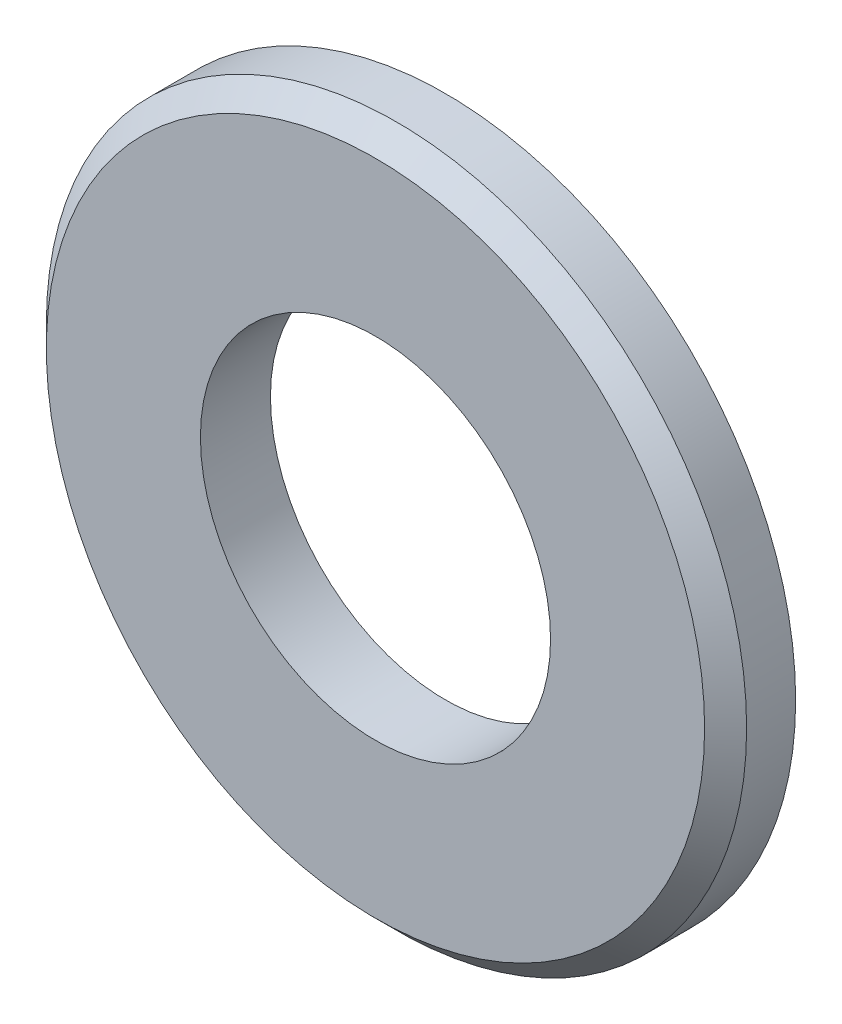
ISO-10303-21;
HEADER;
FILE_DESCRIPTION(('STEP AP214'),'2;1');
FILE_NAME('part.step','',(''),(''),'','','');
FILE_SCHEMA(('AUTOMOTIVE_DESIGN { 1 0 10303 214 1 1 1 1 }'));
ENDSEC;
DATA;
#1=APPLICATION_CONTEXT('core data for automotive mechanical design processes');
#2=APPLICATION_PROTOCOL_DEFINITION('international standard','automotive_design',2000,#1);
#3=PRODUCT_CONTEXT('',#1,'mechanical');
#4=PRODUCT('Part','Part','',(#3));
#5=PRODUCT_RELATED_PRODUCT_CATEGORY('part','',(#4));
#6=PRODUCT_DEFINITION_FORMATION('','',#4);
#7=PRODUCT_DEFINITION_CONTEXT('part definition',#1,'design');
#8=PRODUCT_DEFINITION('design','',#6,#7);
#9=PRODUCT_DEFINITION_SHAPE('','',#8);
#10=(LENGTH_UNIT() NAMED_UNIT(*) SI_UNIT(.MILLI.,.METRE.));
#11=(NAMED_UNIT(*) PLANE_ANGLE_UNIT() SI_UNIT($,.RADIAN.));
#12=(NAMED_UNIT(*) SI_UNIT($,.STERADIAN.) SOLID_ANGLE_UNIT());
#13=UNCERTAINTY_MEASURE_WITH_UNIT(LENGTH_MEASURE(1.E-05),#10,'distance_accuracy_value','');
#14=(GEOMETRIC_REPRESENTATION_CONTEXT(3) GLOBAL_UNCERTAINTY_ASSIGNED_CONTEXT((#13)) GLOBAL_UNIT_ASSIGNED_CONTEXT((#10,
#11,#12)) REPRESENTATION_CONTEXT('',''));
#15=CARTESIAN_POINT('',(0.,0.,0.));
#16=DIRECTION('',(0.,0.,1.));
#17=DIRECTION('',(1.,0.,0.));
#18=AXIS2_PLACEMENT_3D('',#15,#16,#17);
#19=CARTESIAN_POINT('',(0.,0.,-1.));
#20=DIRECTION('',(0.,0.,1.));
#21=DIRECTION('',(1.,0.,0.));
#22=AXIS2_PLACEMENT_3D('',#19,#20,#21);
#23=CYLINDRICAL_SURFACE('',#22,5.);
#24=CARTESIAN_POINT('',(0.,0.,-0.299999999999998));
#25=DIRECTION('',(0.,0.,1.));
#26=DIRECTION('',(1.,0.,0.));
#27=AXIS2_PLACEMENT_3D('',#24,#25,#26);
#28=CIRCLE('',#27,5.);
#29=CARTESIAN_POINT('',(5.,0.,-0.299999999999998));
#30=VERTEX_POINT('',#29);
#31=EDGE_CURVE('E10',#30,#30,#28,.F.);
#32=ORIENTED_EDGE('',*,*,#31,.T.);
#33=EDGE_LOOP('',(#32));
#34=FACE_BOUND('',#33,.T.);
#35=CARTESIAN_POINT('',(0.,0.,-1.));
#36=DIRECTION('',(0.,0.,1.));
#37=DIRECTION('',(1.,0.,0.));
#38=AXIS2_PLACEMENT_3D('',#35,#36,#37);
#39=CIRCLE('',#38,5.);
#40=CARTESIAN_POINT('',(5.,0.,-1.));
#41=VERTEX_POINT('',#40);
#42=EDGE_CURVE('E41',#41,#41,#39,.T.);
#43=ORIENTED_EDGE('',*,*,#42,.T.);
#44=EDGE_LOOP('',(#43));
#45=FACE_BOUND('',#44,.T.);
#46=ADVANCED_FACE('F30',(#34,#45),#23,.T.);
#47=CARTESIAN_POINT('',(0.,0.,-1.));
#48=DIRECTION('',(0.,0.,1.));
#49=DIRECTION('',(1.,0.,0.));
#50=AXIS2_PLACEMENT_3D('',#47,#48,#49);
#51=PLANE('',#50);
#52=CARTESIAN_POINT('',(0.,0.,-1.));
#53=DIRECTION('',(0.,0.,1.));
#54=DIRECTION('',(1.,0.,0.));
#55=AXIS2_PLACEMENT_3D('',#52,#53,#54);
#56=CIRCLE('',#55,2.5);
#57=CARTESIAN_POINT('',(2.5,0.,-1.));
#58=VERTEX_POINT('',#57);
#59=EDGE_CURVE('E45',#58,#58,#56,.T.);
#60=ORIENTED_EDGE('',*,*,#59,.T.);
#61=EDGE_LOOP('',(#60));
#62=FACE_BOUND('',#61,.T.);
#63=ORIENTED_EDGE('',*,*,#42,.F.);
#64=EDGE_LOOP('',(#63));
#65=FACE_BOUND('',#64,.T.);
#66=ADVANCED_FACE('F54',(#62,#65),#51,.F.);
#67=CARTESIAN_POINT('',(0.,0.,0.));
#68=DIRECTION('',(0.,0.,1.));
#69=DIRECTION('',(1.,0.,0.));
#70=AXIS2_PLACEMENT_3D('',#67,#68,#69);
#71=PLANE('',#70);
#72=CARTESIAN_POINT('',(0.,0.,0.));
#73=DIRECTION('',(0.,0.,1.));
#74=DIRECTION('',(1.,0.,0.));
#75=AXIS2_PLACEMENT_3D('',#72,#73,#74);
#76=CIRCLE('',#75,4.7);
#77=CARTESIAN_POINT('',(4.7,0.,0.));
#78=VERTEX_POINT('',#77);
#79=EDGE_CURVE('E37',#78,#78,#76,.T.);
#80=ORIENTED_EDGE('',*,*,#79,.T.);
#81=EDGE_LOOP('',(#80));
#82=FACE_BOUND('',#81,.T.);
#83=CARTESIAN_POINT('',(0.,0.,0.));
#84=DIRECTION('',(0.,0.,1.));
#85=DIRECTION('',(1.,0.,0.));
#86=AXIS2_PLACEMENT_3D('',#83,#84,#85);
#87=CIRCLE('',#86,2.5);
#88=CARTESIAN_POINT('',(2.5,0.,0.));
#89=VERTEX_POINT('',#88);
#90=EDGE_CURVE('E48',#89,#89,#87,.T.);
#91=ORIENTED_EDGE('',*,*,#90,.F.);
#92=EDGE_LOOP('',(#91));
#93=FACE_BOUND('',#92,.T.);
#94=ADVANCED_FACE('F60',(#82,#93),#71,.T.);
#95=CARTESIAN_POINT('',(0.,0.,-1.));
#96=DIRECTION('',(0.,0.,1.));
#97=DIRECTION('',(1.,0.,0.));
#98=AXIS2_PLACEMENT_3D('',#95,#96,#97);
#99=CYLINDRICAL_SURFACE('',#98,2.5);
#100=ORIENTED_EDGE('',*,*,#59,.F.);
#101=EDGE_LOOP('',(#100));
#102=FACE_BOUND('',#101,.T.);
#103=ORIENTED_EDGE('',*,*,#90,.T.);
#104=EDGE_LOOP('',(#103));
#105=FACE_BOUND('',#104,.T.);
#106=ADVANCED_FACE('F57',(#102,#105),#99,.F.);
#107=CARTESIAN_POINT('',(0.,0.,0.));
#108=DIRECTION('',(0.,0.,-1.));
#109=DIRECTION('',(-1.,0.,0.));
#110=AXIS2_PLACEMENT_3D('',#107,#108,#109);
#111=CONICAL_SURFACE('',#110,4.7,0.785398163397448);
#112=ORIENTED_EDGE('',*,*,#31,.F.);
#113=EDGE_LOOP('',(#112));
#114=FACE_BOUND('',#113,.T.);
#115=ORIENTED_EDGE('',*,*,#79,.F.);
#116=EDGE_LOOP('',(#115));
#117=FACE_BOUND('',#116,.T.);
#118=ADVANCED_FACE('F32',(#114,#117),#111,.T.);
#119=CLOSED_SHELL('',(#46,#66,#94,#106,#118));
#120=MANIFOLD_SOLID_BREP('B2',#119);
#121=ADVANCED_BREP_SHAPE_REPRESENTATION('',(#18,#120),#14);
#122=SHAPE_DEFINITION_REPRESENTATION(#9,#121);
ENDSEC;
END-ISO-10303-21;
